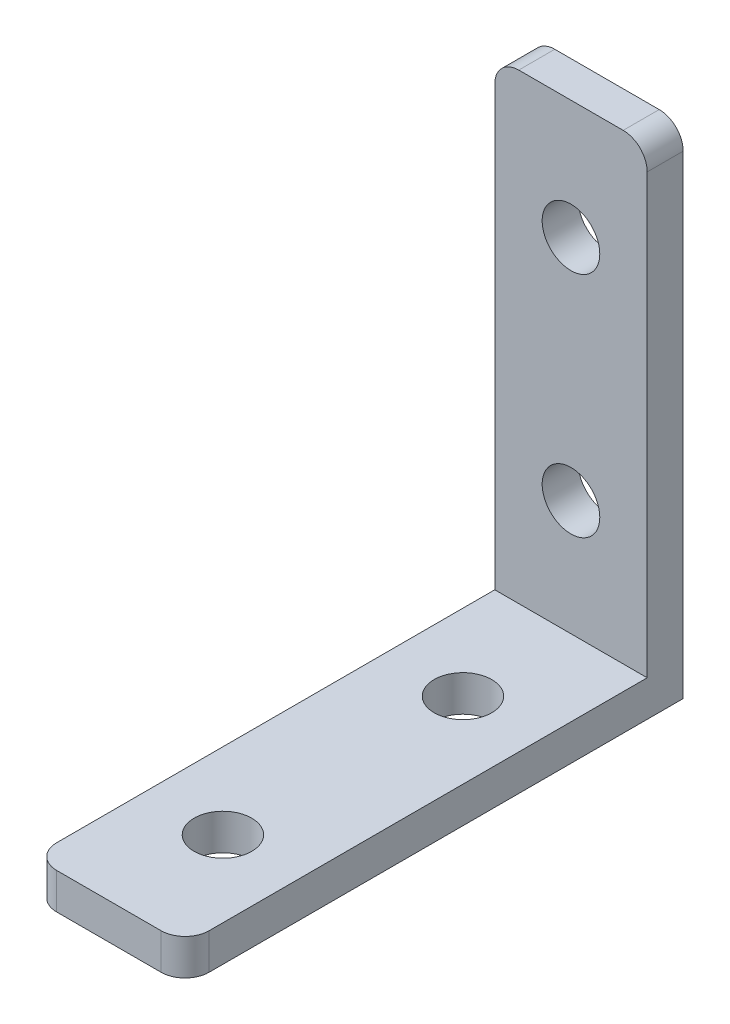
ISO-10303-21;
HEADER;
FILE_DESCRIPTION(('STEP AP214'),'2;1');
FILE_NAME('part.step','',(''),(''),'','','');
FILE_SCHEMA(('AUTOMOTIVE_DESIGN { 1 0 10303 214 1 1 1 1 }'));
ENDSEC;
DATA;
#1=APPLICATION_CONTEXT('core data for automotive mechanical design processes');
#2=APPLICATION_PROTOCOL_DEFINITION('international standard','automotive_design',2000,#1);
#3=PRODUCT_CONTEXT('',#1,'mechanical');
#4=PRODUCT('Part','Part','',(#3));
#5=PRODUCT_RELATED_PRODUCT_CATEGORY('part','',(#4));
#6=PRODUCT_DEFINITION_FORMATION('','',#4);
#7=PRODUCT_DEFINITION_CONTEXT('part definition',#1,'design');
#8=PRODUCT_DEFINITION('design','',#6,#7);
#9=PRODUCT_DEFINITION_SHAPE('','',#8);
#10=(LENGTH_UNIT() NAMED_UNIT(*) SI_UNIT(.MILLI.,.METRE.));
#11=(NAMED_UNIT(*) PLANE_ANGLE_UNIT() SI_UNIT($,.RADIAN.));
#12=(NAMED_UNIT(*) SI_UNIT($,.STERADIAN.) SOLID_ANGLE_UNIT());
#13=UNCERTAINTY_MEASURE_WITH_UNIT(LENGTH_MEASURE(1.E-05),#10,'distance_accuracy_value','');
#14=(GEOMETRIC_REPRESENTATION_CONTEXT(3) GLOBAL_UNCERTAINTY_ASSIGNED_CONTEXT((#13)) GLOBAL_UNIT_ASSIGNED_CONTEXT((#10,
#11,#12)) REPRESENTATION_CONTEXT('',''));
#15=CARTESIAN_POINT('',(0.,0.,0.));
#16=DIRECTION('',(0.,0.,1.));
#17=DIRECTION('',(1.,0.,0.));
#18=AXIS2_PLACEMENT_3D('',#15,#16,#17);
#19=CARTESIAN_POINT('',(0.,0.,3.));
#20=DIRECTION('',(0.,0.,-1.));
#21=DIRECTION('',(-1.,0.,0.));
#22=AXIS2_PLACEMENT_3D('',#19,#20,#21);
#23=PLANE('',#22);
#24=CARTESIAN_POINT('',(0.,-8.15,3.));
#25=DIRECTION('',(0.,0.,1.));
#26=DIRECTION('',(1.,0.,0.));
#27=AXIS2_PLACEMENT_3D('',#24,#25,#26);
#28=CIRCLE('',#27,2.4);
#29=CARTESIAN_POINT('',(2.4,-8.15,3.));
#30=VERTEX_POINT('',#29);
#31=EDGE_CURVE('E149',#30,#30,#28,.T.);
#32=ORIENTED_EDGE('',*,*,#31,.F.);
#33=EDGE_LOOP('',(#32));
#34=FACE_BOUND('',#33,.T.);
#35=CARTESIAN_POINT('',(0.,10.85,3.));
#36=DIRECTION('',(0.,0.,1.));
#37=DIRECTION('',(1.,0.,0.));
#38=AXIS2_PLACEMENT_3D('',#35,#36,#37);
#39=CIRCLE('',#38,2.4);
#40=CARTESIAN_POINT('',(2.4,10.85,3.));
#41=VERTEX_POINT('',#40);
#42=EDGE_CURVE('E155',#41,#41,#39,.T.);
#43=ORIENTED_EDGE('',*,*,#42,.F.);
#44=EDGE_LOOP('',(#43));
#45=FACE_BOUND('',#44,.T.);
#46=DIRECTION('',(-1.,0.,0.));
#47=VECTOR('',#46,1.);
#48=CARTESIAN_POINT('',(-6.35,20.75,3.));
#49=LINE('',#48,#47);
#50=CARTESIAN_POINT('',(4.35,20.75,3.));
#51=VERTEX_POINT('',#50);
#52=CARTESIAN_POINT('',(-4.35,20.75,3.));
#53=VERTEX_POINT('',#52);
#54=EDGE_CURVE('E124',#51,#53,#49,.T.);
#55=ORIENTED_EDGE('',*,*,#54,.T.);
#56=CARTESIAN_POINT('',(-4.35,18.75,3.));
#57=DIRECTION('',(0.,0.,-1.));
#58=DIRECTION('',(-1.,0.,0.));
#59=AXIS2_PLACEMENT_3D('',#56,#57,#58);
#60=CIRCLE('',#59,2.);
#61=CARTESIAN_POINT('',(-6.35,18.75,3.));
#62=VERTEX_POINT('',#61);
#63=EDGE_CURVE('E119',#53,#62,#60,.F.);
#64=ORIENTED_EDGE('',*,*,#63,.T.);
#65=DIRECTION('',(0.,-1.,0.));
#66=VECTOR('',#65,1.);
#67=CARTESIAN_POINT('',(-6.35,-20.75,3.));
#68=LINE('',#67,#66);
#69=CARTESIAN_POINT('',(-6.35,-17.75,3.));
#70=VERTEX_POINT('',#69);
#71=EDGE_CURVE('E111',#62,#70,#68,.T.);
#72=ORIENTED_EDGE('',*,*,#71,.T.);
#73=DIRECTION('',(-1.,0.,0.));
#74=VECTOR('',#73,1.);
#75=CARTESIAN_POINT('',(6.35,-17.75,3.));
#76=LINE('',#75,#74);
#77=CARTESIAN_POINT('',(6.35,-17.75,3.));
#78=VERTEX_POINT('',#77);
#79=EDGE_CURVE('E116',#78,#70,#76,.T.);
#80=ORIENTED_EDGE('',*,*,#79,.F.);
#81=DIRECTION('',(0.,1.,0.));
#82=VECTOR('',#81,1.);
#83=CARTESIAN_POINT('',(6.35,-20.75,3.));
#84=LINE('',#83,#82);
#85=CARTESIAN_POINT('',(6.35,18.75,3.));
#86=VERTEX_POINT('',#85);
#87=EDGE_CURVE('E161',#78,#86,#84,.T.);
#88=ORIENTED_EDGE('',*,*,#87,.T.);
#89=CARTESIAN_POINT('',(4.35,18.75,3.));
#90=DIRECTION('',(0.,0.,-1.));
#91=DIRECTION('',(-1.,0.,0.));
#92=AXIS2_PLACEMENT_3D('',#89,#90,#91);
#93=CIRCLE('',#92,2.);
#94=EDGE_CURVE('E190',#86,#51,#93,.F.);
#95=ORIENTED_EDGE('',*,*,#94,.T.);
#96=EDGE_LOOP('',(#55,#64,#72,#80,#88,#95));
#97=FACE_BOUND('',#96,.T.);
#98=ADVANCED_FACE('F33',(#34,#45,#97),#23,.F.);
#99=CARTESIAN_POINT('',(0.,0.,0.));
#100=DIRECTION('',(0.,0.,-1.));
#101=DIRECTION('',(-1.,0.,0.));
#102=AXIS2_PLACEMENT_3D('',#99,#100,#101);
#103=PLANE('',#102);
#104=CARTESIAN_POINT('',(0.,10.85,0.));
#105=DIRECTION('',(0.,0.,1.));
#106=DIRECTION('',(1.,0.,0.));
#107=AXIS2_PLACEMENT_3D('',#104,#105,#106);
#108=CIRCLE('',#107,2.4);
#109=CARTESIAN_POINT('',(2.4,10.85,0.));
#110=VERTEX_POINT('',#109);
#111=EDGE_CURVE('E152',#110,#110,#108,.T.);
#112=ORIENTED_EDGE('',*,*,#111,.T.);
#113=EDGE_LOOP('',(#112));
#114=FACE_BOUND('',#113,.T.);
#115=DIRECTION('',(0.,-1.,0.));
#116=VECTOR('',#115,1.);
#117=CARTESIAN_POINT('',(-6.35,-20.75,0.));
#118=LINE('',#117,#116);
#119=CARTESIAN_POINT('',(-6.35,18.75,0.));
#120=VERTEX_POINT('',#119);
#121=CARTESIAN_POINT('',(-6.35,-20.75,0.));
#122=VERTEX_POINT('',#121);
#123=EDGE_CURVE('E170',#120,#122,#118,.T.);
#124=ORIENTED_EDGE('',*,*,#123,.F.);
#125=CARTESIAN_POINT('',(-4.35,18.75,0.));
#126=DIRECTION('',(0.,0.,-1.));
#127=DIRECTION('',(-1.,0.,0.));
#128=AXIS2_PLACEMENT_3D('',#125,#126,#127);
#129=CIRCLE('',#128,2.);
#130=CARTESIAN_POINT('',(-4.35,20.75,0.));
#131=VERTEX_POINT('',#130);
#132=EDGE_CURVE('E183',#120,#131,#129,.T.);
#133=ORIENTED_EDGE('',*,*,#132,.T.);
#134=DIRECTION('',(-1.,0.,0.));
#135=VECTOR('',#134,1.);
#136=CARTESIAN_POINT('',(-6.35,20.75,0.));
#137=LINE('',#136,#135);
#138=CARTESIAN_POINT('',(4.35,20.75,0.));
#139=VERTEX_POINT('',#138);
#140=EDGE_CURVE('E167',#139,#131,#137,.T.);
#141=ORIENTED_EDGE('',*,*,#140,.F.);
#142=CARTESIAN_POINT('',(4.35,18.75,0.));
#143=DIRECTION('',(0.,0.,-1.));
#144=DIRECTION('',(-1.,0.,0.));
#145=AXIS2_PLACEMENT_3D('',#142,#143,#144);
#146=CIRCLE('',#145,2.);
#147=CARTESIAN_POINT('',(6.35,18.75,0.));
#148=VERTEX_POINT('',#147);
#149=EDGE_CURVE('E181',#139,#148,#146,.T.);
#150=ORIENTED_EDGE('',*,*,#149,.T.);
#151=DIRECTION('',(0.,1.,0.));
#152=VECTOR('',#151,1.);
#153=CARTESIAN_POINT('',(6.35,-20.75,0.));
#154=LINE('',#153,#152);
#155=CARTESIAN_POINT('',(6.35,-20.75,0.));
#156=VERTEX_POINT('',#155);
#157=EDGE_CURVE('E158',#156,#148,#154,.T.);
#158=ORIENTED_EDGE('',*,*,#157,.F.);
#159=DIRECTION('',(1.,0.,0.));
#160=VECTOR('',#159,1.);
#161=CARTESIAN_POINT('',(-6.35,-20.75,0.));
#162=LINE('',#161,#160);
#163=EDGE_CURVE('E163',#122,#156,#162,.T.);
#164=ORIENTED_EDGE('',*,*,#163,.F.);
#165=EDGE_LOOP('',(#124,#133,#141,#150,#158,#164));
#166=FACE_BOUND('',#165,.T.);
#167=CARTESIAN_POINT('',(0.,-8.15,0.));
#168=DIRECTION('',(0.,0.,1.));
#169=DIRECTION('',(1.,0.,0.));
#170=AXIS2_PLACEMENT_3D('',#167,#168,#169);
#171=CIRCLE('',#170,2.4);
#172=CARTESIAN_POINT('',(2.4,-8.15,0.));
#173=VERTEX_POINT('',#172);
#174=EDGE_CURVE('E147',#173,#173,#171,.T.);
#175=ORIENTED_EDGE('',*,*,#174,.T.);
#176=EDGE_LOOP('',(#175));
#177=FACE_BOUND('',#176,.T.);
#178=ADVANCED_FACE('F227',(#114,#166,#177),#103,.T.);
#179=CARTESIAN_POINT('',(6.35,-20.75,3.));
#180=DIRECTION('',(-1.,0.,0.));
#181=DIRECTION('',(0.,0.,1.));
#182=AXIS2_PLACEMENT_3D('',#179,#180,#181);
#183=PLANE('',#182);
#184=ORIENTED_EDGE('',*,*,#157,.T.);
#185=DIRECTION('',(0.,0.,-1.));
#186=VECTOR('',#185,1.);
#187=CARTESIAN_POINT('',(6.35,18.75,3.));
#188=LINE('',#187,#186);
#189=EDGE_CURVE('E196',#148,#86,#188,.F.);
#190=ORIENTED_EDGE('',*,*,#189,.T.);
#191=ORIENTED_EDGE('',*,*,#87,.F.);
#192=DIRECTION('',(0.,0.,-1.));
#193=VECTOR('',#192,1.);
#194=CARTESIAN_POINT('',(6.35,-17.75,41.5));
#195=LINE('',#194,#193);
#196=CARTESIAN_POINT('',(6.35,-17.75,39.5));
#197=VERTEX_POINT('',#196);
#198=EDGE_CURVE('E133',#197,#78,#195,.T.);
#199=ORIENTED_EDGE('',*,*,#198,.F.);
#200=DIRECTION('',(0.,-1.,0.));
#201=VECTOR('',#200,1.);
#202=CARTESIAN_POINT('',(6.35,-20.75,39.5));
#203=LINE('',#202,#201);
#204=CARTESIAN_POINT('',(6.35,-20.75,39.5));
#205=VERTEX_POINT('',#204);
#206=EDGE_CURVE('E193',#197,#205,#203,.T.);
#207=ORIENTED_EDGE('',*,*,#206,.T.);
#208=DIRECTION('',(0.,0.,-1.));
#209=VECTOR('',#208,1.);
#210=CARTESIAN_POINT('',(6.35,-20.75,3.));
#211=LINE('',#210,#209);
#212=EDGE_CURVE('E123',#205,#156,#211,.T.);
#213=ORIENTED_EDGE('',*,*,#212,.T.);
#214=EDGE_LOOP('',(#184,#190,#191,#199,#207,#213));
#215=FACE_BOUND('',#214,.T.);
#216=ADVANCED_FACE('F210',(#215),#183,.F.);
#217=CARTESIAN_POINT('',(-6.35,20.75,3.));
#218=DIRECTION('',(0.,-1.,0.));
#219=DIRECTION('',(0.,0.,-1.));
#220=AXIS2_PLACEMENT_3D('',#217,#218,#219);
#221=PLANE('',#220);
#222=ORIENTED_EDGE('',*,*,#140,.T.);
#223=DIRECTION('',(0.,0.,-1.));
#224=VECTOR('',#223,1.);
#225=CARTESIAN_POINT('',(-4.35,20.75,3.));
#226=LINE('',#225,#224);
#227=EDGE_CURVE('E188',#131,#53,#226,.F.);
#228=ORIENTED_EDGE('',*,*,#227,.T.);
#229=ORIENTED_EDGE('',*,*,#54,.F.);
#230=DIRECTION('',(0.,0.,-1.));
#231=VECTOR('',#230,1.);
#232=CARTESIAN_POINT('',(4.35,20.75,3.));
#233=LINE('',#232,#231);
#234=EDGE_CURVE('E185',#51,#139,#233,.T.);
#235=ORIENTED_EDGE('',*,*,#234,.T.);
#236=EDGE_LOOP('',(#222,#228,#229,#235));
#237=FACE_BOUND('',#236,.T.);
#238=ADVANCED_FACE('F246',(#237),#221,.F.);
#239=CARTESIAN_POINT('',(-6.35,-20.75,3.));
#240=DIRECTION('',(1.,0.,0.));
#241=DIRECTION('',(0.,0.,-1.));
#242=AXIS2_PLACEMENT_3D('',#239,#240,#241);
#243=PLANE('',#242);
#244=ORIENTED_EDGE('',*,*,#71,.F.);
#245=DIRECTION('',(0.,0.,-1.));
#246=VECTOR('',#245,1.);
#247=CARTESIAN_POINT('',(-6.35,18.75,3.));
#248=LINE('',#247,#246);
#249=EDGE_CURVE('E179',#62,#120,#248,.T.);
#250=ORIENTED_EDGE('',*,*,#249,.T.);
#251=ORIENTED_EDGE('',*,*,#123,.T.);
#252=DIRECTION('',(0.,0.,-1.));
#253=VECTOR('',#252,1.);
#254=CARTESIAN_POINT('',(-6.35,-20.75,3.));
#255=LINE('',#254,#253);
#256=CARTESIAN_POINT('',(-6.35,-20.75,39.5));
#257=VERTEX_POINT('',#256);
#258=EDGE_CURVE('E176',#257,#122,#255,.T.);
#259=ORIENTED_EDGE('',*,*,#258,.F.);
#260=DIRECTION('',(0.,-1.,0.));
#261=VECTOR('',#260,1.);
#262=CARTESIAN_POINT('',(-6.35,-20.75,39.5));
#263=LINE('',#262,#261);
#264=CARTESIAN_POINT('',(-6.35,-17.75,39.5));
#265=VERTEX_POINT('',#264);
#266=EDGE_CURVE('E130',#257,#265,#263,.F.);
#267=ORIENTED_EDGE('',*,*,#266,.T.);
#268=DIRECTION('',(0.,0.,-1.));
#269=VECTOR('',#268,1.);
#270=CARTESIAN_POINT('',(-6.35,-17.75,41.5));
#271=LINE('',#270,#269);
#272=EDGE_CURVE('E127',#265,#70,#271,.T.);
#273=ORIENTED_EDGE('',*,*,#272,.T.);
#274=EDGE_LOOP('',(#244,#250,#251,#259,#267,#273));
#275=FACE_BOUND('',#274,.T.);
#276=ADVANCED_FACE('F128',(#275),#243,.F.);
#277=CARTESIAN_POINT('',(-6.35,-20.75,3.));
#278=DIRECTION('',(0.,1.,0.));
#279=DIRECTION('',(0.,0.,1.));
#280=AXIS2_PLACEMENT_3D('',#277,#278,#279);
#281=PLANE('',#280);
#282=CARTESIAN_POINT('',(0.,-20.75,12.));
#283=DIRECTION('',(0.,1.,0.));
#284=DIRECTION('',(0.,0.,1.));
#285=AXIS2_PLACEMENT_3D('',#282,#283,#284);
#286=CIRCLE('',#285,2.4);
#287=CARTESIAN_POINT('',(0.,-20.75,14.4));
#288=VERTEX_POINT('',#287);
#289=EDGE_CURVE('E139',#288,#288,#286,.T.);
#290=ORIENTED_EDGE('',*,*,#289,.T.);
#291=EDGE_LOOP('',(#290));
#292=FACE_BOUND('',#291,.T.);
#293=CARTESIAN_POINT('',(0.,-20.75,32.));
#294=DIRECTION('',(0.,1.,0.));
#295=DIRECTION('',(0.,0.,1.));
#296=AXIS2_PLACEMENT_3D('',#293,#294,#295);
#297=CIRCLE('',#296,2.4);
#298=CARTESIAN_POINT('',(0.,-20.75,34.4));
#299=VERTEX_POINT('',#298);
#300=EDGE_CURVE('E143',#299,#299,#297,.T.);
#301=ORIENTED_EDGE('',*,*,#300,.T.);
#302=EDGE_LOOP('',(#301));
#303=FACE_BOUND('',#302,.T.);
#304=DIRECTION('',(-1.,0.,0.));
#305=VECTOR('',#304,1.);
#306=CARTESIAN_POINT('',(6.35,-20.75,41.5));
#307=LINE('',#306,#305);
#308=CARTESIAN_POINT('',(4.35,-20.75,41.5));
#309=VERTEX_POINT('',#308);
#310=CARTESIAN_POINT('',(-4.35,-20.75,41.5));
#311=VERTEX_POINT('',#310);
#312=EDGE_CURVE('E138',#309,#311,#307,.T.);
#313=ORIENTED_EDGE('',*,*,#312,.T.);
#314=CARTESIAN_POINT('',(-4.35,-20.75,39.5));
#315=DIRECTION('',(0.,1.,0.));
#316=DIRECTION('',(0.,0.,1.));
#317=AXIS2_PLACEMENT_3D('',#314,#315,#316);
#318=CIRCLE('',#317,2.);
#319=EDGE_CURVE('E48',#311,#257,#318,.F.);
#320=ORIENTED_EDGE('',*,*,#319,.T.);
#321=ORIENTED_EDGE('',*,*,#258,.T.);
#322=ORIENTED_EDGE('',*,*,#163,.T.);
#323=ORIENTED_EDGE('',*,*,#212,.F.);
#324=CARTESIAN_POINT('',(4.35,-20.75,39.5));
#325=DIRECTION('',(0.,1.,0.));
#326=DIRECTION('',(0.,0.,1.));
#327=AXIS2_PLACEMENT_3D('',#324,#325,#326);
#328=CIRCLE('',#327,2.);
#329=EDGE_CURVE('E56',#205,#309,#328,.F.);
#330=ORIENTED_EDGE('',*,*,#329,.T.);
#331=EDGE_LOOP('',(#313,#320,#321,#322,#323,#330));
#332=FACE_BOUND('',#331,.T.);
#333=ADVANCED_FACE('F213',(#292,#303,#332),#281,.F.);
#334=CARTESIAN_POINT('',(0.,10.85,3.));
#335=DIRECTION('',(0.,0.,-1.));
#336=DIRECTION('',(-1.,0.,0.));
#337=AXIS2_PLACEMENT_3D('',#334,#335,#336);
#338=CYLINDRICAL_SURFACE('',#337,2.4);
#339=ORIENTED_EDGE('',*,*,#42,.T.);
#340=EDGE_LOOP('',(#339));
#341=FACE_BOUND('',#340,.T.);
#342=ORIENTED_EDGE('',*,*,#111,.F.);
#343=EDGE_LOOP('',(#342));
#344=FACE_BOUND('',#343,.T.);
#345=ADVANCED_FACE('F238',(#341,#344),#338,.F.);
#346=CARTESIAN_POINT('',(0.,-8.15,3.));
#347=DIRECTION('',(0.,0.,-1.));
#348=DIRECTION('',(-1.,0.,0.));
#349=AXIS2_PLACEMENT_3D('',#346,#347,#348);
#350=CYLINDRICAL_SURFACE('',#349,2.4);
#351=ORIENTED_EDGE('',*,*,#31,.T.);
#352=EDGE_LOOP('',(#351));
#353=FACE_BOUND('',#352,.T.);
#354=ORIENTED_EDGE('',*,*,#174,.F.);
#355=EDGE_LOOP('',(#354));
#356=FACE_BOUND('',#355,.T.);
#357=ADVANCED_FACE('F272',(#353,#356),#350,.F.);
#358=CARTESIAN_POINT('',(6.35,-17.75,41.5));
#359=DIRECTION('',(0.,-1.,0.));
#360=DIRECTION('',(0.,0.,-1.));
#361=AXIS2_PLACEMENT_3D('',#358,#359,#360);
#362=PLANE('',#361);
#363=CARTESIAN_POINT('',(0.,-17.75,12.));
#364=DIRECTION('',(0.,1.,0.));
#365=DIRECTION('',(0.,0.,1.));
#366=AXIS2_PLACEMENT_3D('',#363,#364,#365);
#367=CIRCLE('',#366,2.4);
#368=CARTESIAN_POINT('',(0.,-17.75,14.4));
#369=VERTEX_POINT('',#368);
#370=EDGE_CURVE('E296',#369,#369,#367,.T.);
#371=ORIENTED_EDGE('',*,*,#370,.F.);
#372=EDGE_LOOP('',(#371));
#373=FACE_BOUND('',#372,.T.);
#374=CARTESIAN_POINT('',(0.,-17.75,32.));
#375=DIRECTION('',(0.,1.,0.));
#376=DIRECTION('',(0.,0.,1.));
#377=AXIS2_PLACEMENT_3D('',#374,#375,#376);
#378=CIRCLE('',#377,2.4);
#379=CARTESIAN_POINT('',(0.,-17.75,34.4));
#380=VERTEX_POINT('',#379);
#381=EDGE_CURVE('E292',#380,#380,#378,.T.);
#382=ORIENTED_EDGE('',*,*,#381,.F.);
#383=EDGE_LOOP('',(#382));
#384=FACE_BOUND('',#383,.T.);
#385=ORIENTED_EDGE('',*,*,#272,.F.);
#386=CARTESIAN_POINT('',(-4.35,-17.75,39.5));
#387=DIRECTION('',(0.,-1.,0.));
#388=DIRECTION('',(0.,0.,-1.));
#389=AXIS2_PLACEMENT_3D('',#386,#387,#388);
#390=CIRCLE('',#389,2.);
#391=CARTESIAN_POINT('',(-4.35,-17.75,41.5));
#392=VERTEX_POINT('',#391);
#393=EDGE_CURVE('E11',#265,#392,#390,.F.);
#394=ORIENTED_EDGE('',*,*,#393,.T.);
#395=DIRECTION('',(-1.,0.,0.));
#396=VECTOR('',#395,1.);
#397=CARTESIAN_POINT('',(6.35,-17.75,41.5));
#398=LINE('',#397,#396);
#399=CARTESIAN_POINT('',(4.35,-17.75,41.5));
#400=VERTEX_POINT('',#399);
#401=EDGE_CURVE('E134',#400,#392,#398,.T.);
#402=ORIENTED_EDGE('',*,*,#401,.F.);
#403=CARTESIAN_POINT('',(4.35,-17.75,39.5));
#404=DIRECTION('',(0.,-1.,0.));
#405=DIRECTION('',(0.,0.,-1.));
#406=AXIS2_PLACEMENT_3D('',#403,#404,#405);
#407=CIRCLE('',#406,2.);
#408=EDGE_CURVE('E41',#400,#197,#407,.F.);
#409=ORIENTED_EDGE('',*,*,#408,.T.);
#410=ORIENTED_EDGE('',*,*,#198,.T.);
#411=ORIENTED_EDGE('',*,*,#79,.T.);
#412=EDGE_LOOP('',(#385,#394,#402,#409,#410,#411));
#413=FACE_BOUND('',#412,.T.);
#414=ADVANCED_FACE('F136',(#373,#384,#413),#362,.F.);
#415=CARTESIAN_POINT('',(0.,0.,41.5));
#416=DIRECTION('',(0.,0.,-1.));
#417=DIRECTION('',(-1.,0.,0.));
#418=AXIS2_PLACEMENT_3D('',#415,#416,#417);
#419=PLANE('',#418);
#420=ORIENTED_EDGE('',*,*,#401,.T.);
#421=DIRECTION('',(0.,-1.,0.));
#422=VECTOR('',#421,1.);
#423=CARTESIAN_POINT('',(-4.35,0.,41.5));
#424=LINE('',#423,#422);
#425=EDGE_CURVE('E200',#392,#311,#424,.T.);
#426=ORIENTED_EDGE('',*,*,#425,.T.);
#427=ORIENTED_EDGE('',*,*,#312,.F.);
#428=DIRECTION('',(0.,-1.,0.));
#429=VECTOR('',#428,1.);
#430=CARTESIAN_POINT('',(4.35,0.,41.5));
#431=LINE('',#430,#429);
#432=EDGE_CURVE('E198',#309,#400,#431,.F.);
#433=ORIENTED_EDGE('',*,*,#432,.T.);
#434=EDGE_LOOP('',(#420,#426,#427,#433));
#435=FACE_BOUND('',#434,.T.);
#436=ADVANCED_FACE('F212',(#435),#419,.F.);
#437=CARTESIAN_POINT('',(0.,-59.25,32.));
#438=DIRECTION('',(0.,1.,0.));
#439=DIRECTION('',(0.,0.,1.));
#440=AXIS2_PLACEMENT_3D('',#437,#438,#439);
#441=CYLINDRICAL_SURFACE('',#440,2.4);
#442=ORIENTED_EDGE('',*,*,#381,.T.);
#443=EDGE_LOOP('',(#442));
#444=FACE_BOUND('',#443,.T.);
#445=ORIENTED_EDGE('',*,*,#300,.F.);
#446=EDGE_LOOP('',(#445));
#447=FACE_BOUND('',#446,.T.);
#448=ADVANCED_FACE('F258',(#444,#447),#441,.F.);
#449=CARTESIAN_POINT('',(0.,-59.25,12.));
#450=DIRECTION('',(0.,1.,0.));
#451=DIRECTION('',(0.,0.,1.));
#452=AXIS2_PLACEMENT_3D('',#449,#450,#451);
#453=CYLINDRICAL_SURFACE('',#452,2.4);
#454=ORIENTED_EDGE('',*,*,#370,.T.);
#455=EDGE_LOOP('',(#454));
#456=FACE_BOUND('',#455,.T.);
#457=ORIENTED_EDGE('',*,*,#289,.F.);
#458=EDGE_LOOP('',(#457));
#459=FACE_BOUND('',#458,.T.);
#460=ADVANCED_FACE('F253',(#456,#459),#453,.F.);
#461=CARTESIAN_POINT('',(-4.35,18.75,3.));
#462=DIRECTION('',(0.,0.,-1.));
#463=DIRECTION('',(-1.,0.,0.));
#464=AXIS2_PLACEMENT_3D('',#461,#462,#463);
#465=CYLINDRICAL_SURFACE('',#464,2.);
#466=ORIENTED_EDGE('',*,*,#63,.F.);
#467=ORIENTED_EDGE('',*,*,#227,.F.);
#468=ORIENTED_EDGE('',*,*,#132,.F.);
#469=ORIENTED_EDGE('',*,*,#249,.F.);
#470=EDGE_LOOP('',(#466,#467,#468,#469));
#471=FACE_BOUND('',#470,.T.);
#472=ADVANCED_FACE('F223',(#471),#465,.T.);
#473=CARTESIAN_POINT('',(4.35,18.75,3.));
#474=DIRECTION('',(0.,0.,-1.));
#475=DIRECTION('',(-1.,0.,0.));
#476=AXIS2_PLACEMENT_3D('',#473,#474,#475);
#477=CYLINDRICAL_SURFACE('',#476,2.);
#478=ORIENTED_EDGE('',*,*,#94,.F.);
#479=ORIENTED_EDGE('',*,*,#189,.F.);
#480=ORIENTED_EDGE('',*,*,#149,.F.);
#481=ORIENTED_EDGE('',*,*,#234,.F.);
#482=EDGE_LOOP('',(#478,#479,#480,#481));
#483=FACE_BOUND('',#482,.T.);
#484=ADVANCED_FACE('F218',(#483),#477,.T.);
#485=CARTESIAN_POINT('',(-4.35,0.,39.5));
#486=DIRECTION('',(0.,-1.,0.));
#487=DIRECTION('',(0.,0.,-1.));
#488=AXIS2_PLACEMENT_3D('',#485,#486,#487);
#489=CYLINDRICAL_SURFACE('',#488,2.);
#490=ORIENTED_EDGE('',*,*,#393,.F.);
#491=ORIENTED_EDGE('',*,*,#266,.F.);
#492=ORIENTED_EDGE('',*,*,#319,.F.);
#493=ORIENTED_EDGE('',*,*,#425,.F.);
#494=EDGE_LOOP('',(#490,#491,#492,#493));
#495=FACE_BOUND('',#494,.T.);
#496=ADVANCED_FACE('F216',(#495),#489,.T.);
#497=CARTESIAN_POINT('',(4.35,-20.75,39.5));
#498=DIRECTION('',(0.,-1.,0.));
#499=DIRECTION('',(0.,0.,-1.));
#500=AXIS2_PLACEMENT_3D('',#497,#498,#499);
#501=CYLINDRICAL_SURFACE('',#500,2.);
#502=ORIENTED_EDGE('',*,*,#408,.F.);
#503=ORIENTED_EDGE('',*,*,#432,.F.);
#504=ORIENTED_EDGE('',*,*,#329,.F.);
#505=ORIENTED_EDGE('',*,*,#206,.F.);
#506=EDGE_LOOP('',(#502,#503,#504,#505));
#507=FACE_BOUND('',#506,.T.);
#508=ADVANCED_FACE('F35',(#507),#501,.T.);
#509=CLOSED_SHELL('',(#98,#178,#216,#238,#276,#333,#345,#357,#414,#436,#448,#460,#472,#484,#496,#508));
#510=MANIFOLD_SOLID_BREP('B2',#509);
#511=ADVANCED_BREP_SHAPE_REPRESENTATION('',(#18,#510),#14);
#512=SHAPE_DEFINITION_REPRESENTATION(#9,#511);
ENDSEC;
END-ISO-10303-21;
